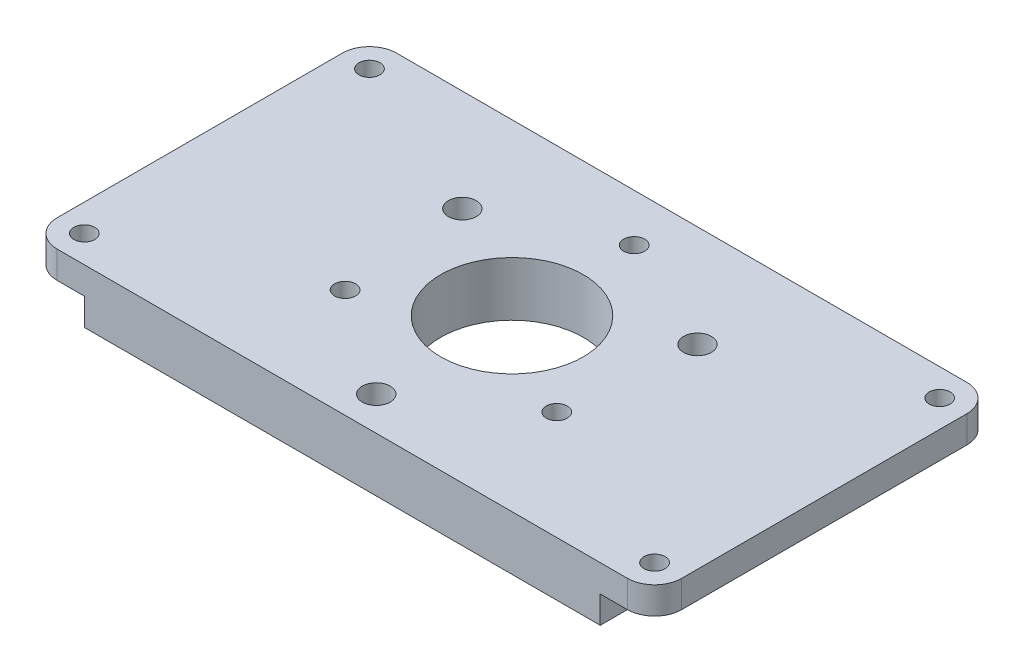
ISO-10303-21;
HEADER;
FILE_DESCRIPTION(('STEP AP214'),'2;1');
FILE_NAME('part.step','',(''),(''),'','','');
FILE_SCHEMA(('AUTOMOTIVE_DESIGN { 1 0 10303 214 1 1 1 1 }'));
ENDSEC;
DATA;
#1=APPLICATION_CONTEXT('core data for automotive mechanical design processes');
#2=APPLICATION_PROTOCOL_DEFINITION('international standard','automotive_design',2000,#1);
#3=PRODUCT_CONTEXT('',#1,'mechanical');
#4=PRODUCT('Part','Part','',(#3));
#5=PRODUCT_RELATED_PRODUCT_CATEGORY('part','',(#4));
#6=PRODUCT_DEFINITION_FORMATION('','',#4);
#7=PRODUCT_DEFINITION_CONTEXT('part definition',#1,'design');
#8=PRODUCT_DEFINITION('design','',#6,#7);
#9=PRODUCT_DEFINITION_SHAPE('','',#8);
#10=(LENGTH_UNIT() NAMED_UNIT(*) SI_UNIT(.MILLI.,.METRE.));
#11=(NAMED_UNIT(*) PLANE_ANGLE_UNIT() SI_UNIT($,.RADIAN.));
#12=(NAMED_UNIT(*) SI_UNIT($,.STERADIAN.) SOLID_ANGLE_UNIT());
#13=UNCERTAINTY_MEASURE_WITH_UNIT(LENGTH_MEASURE(1.E-05),#10,'distance_accuracy_value','');
#14=(GEOMETRIC_REPRESENTATION_CONTEXT(3) GLOBAL_UNCERTAINTY_ASSIGNED_CONTEXT((#13)) GLOBAL_UNIT_ASSIGNED_CONTEXT((#10,
#11,#12)) REPRESENTATION_CONTEXT('',''));
#15=CARTESIAN_POINT('',(0.,0.,0.));
#16=DIRECTION('',(0.,0.,1.));
#17=DIRECTION('',(1.,0.,0.));
#18=AXIS2_PLACEMENT_3D('',#15,#16,#17);
#19=CARTESIAN_POINT('',(0.,-4.,-18.));
#20=DIRECTION('',(0.,1.,0.));
#21=DIRECTION('',(0.,0.,1.));
#22=AXIS2_PLACEMENT_3D('',#19,#20,#21);
#23=CYLINDRICAL_SURFACE('',#22,1.55);
#24=CARTESIAN_POINT('',(0.,4.,-18.));
#25=DIRECTION('',(0.,1.,0.));
#26=DIRECTION('',(0.,0.,1.));
#27=AXIS2_PLACEMENT_3D('',#24,#25,#26);
#28=CIRCLE('',#27,1.55);
#29=CARTESIAN_POINT('',(0.,4.,-16.45));
#30=VERTEX_POINT('',#29);
#31=EDGE_CURVE('E331',#30,#30,#28,.T.);
#32=ORIENTED_EDGE('',*,*,#31,.T.);
#33=EDGE_LOOP('',(#32));
#34=FACE_BOUND('',#33,.T.);
#35=CARTESIAN_POINT('',(0.,1.,-18.));
#36=DIRECTION('',(0.,-1.,0.));
#37=DIRECTION('',(0.,0.,-1.));
#38=AXIS2_PLACEMENT_3D('',#35,#36,#37);
#39=CIRCLE('',#38,1.55);
#40=CARTESIAN_POINT('',(0.,1.,-19.55));
#41=VERTEX_POINT('',#40);
#42=EDGE_CURVE('E43',#41,#41,#39,.F.);
#43=ORIENTED_EDGE('',*,*,#42,.F.);
#44=EDGE_LOOP('',(#43));
#45=FACE_BOUND('',#44,.T.);
#46=ADVANCED_FACE('F39',(#34,#45),#23,.F.);
#47=CARTESIAN_POINT('',(15.5884572681211,-4.,8.99999999999927));
#48=DIRECTION('',(0.,1.,0.));
#49=DIRECTION('',(0.,0.,1.));
#50=AXIS2_PLACEMENT_3D('',#47,#48,#49);
#51=CYLINDRICAL_SURFACE('',#50,1.55);
#52=CARTESIAN_POINT('',(15.5884572681211,4.,8.99999999999927));
#53=DIRECTION('',(0.,1.,0.));
#54=DIRECTION('',(0.,0.,1.));
#55=AXIS2_PLACEMENT_3D('',#52,#53,#54);
#56=CIRCLE('',#55,1.55);
#57=CARTESIAN_POINT('',(15.5884572681211,4.,10.5499999999993));
#58=VERTEX_POINT('',#57);
#59=EDGE_CURVE('E328',#58,#58,#56,.T.);
#60=ORIENTED_EDGE('',*,*,#59,.T.);
#61=EDGE_LOOP('',(#60));
#62=FACE_BOUND('',#61,.T.);
#63=CARTESIAN_POINT('',(15.5884572681211,1.,8.99999999999927));
#64=DIRECTION('',(0.,-1.,0.));
#65=DIRECTION('',(0.,0.,-1.));
#66=AXIS2_PLACEMENT_3D('',#63,#64,#65);
#67=CIRCLE('',#66,1.55);
#68=CARTESIAN_POINT('',(15.5884572681211,1.,7.44999999999927));
#69=VERTEX_POINT('',#68);
#70=EDGE_CURVE('E218',#69,#69,#67,.F.);
#71=ORIENTED_EDGE('',*,*,#70,.F.);
#72=EDGE_LOOP('',(#71));
#73=FACE_BOUND('',#72,.T.);
#74=ADVANCED_FACE('F229',(#62,#73),#51,.F.);
#75=CARTESIAN_POINT('',(-15.5884572681186,-4.,9.00000000000072));
#76=DIRECTION('',(0.,1.,0.));
#77=DIRECTION('',(0.,0.,1.));
#78=AXIS2_PLACEMENT_3D('',#75,#76,#77);
#79=CYLINDRICAL_SURFACE('',#78,1.55);
#80=CARTESIAN_POINT('',(-15.5884572681186,4.,9.00000000000072));
#81=DIRECTION('',(0.,1.,0.));
#82=DIRECTION('',(0.,0.,1.));
#83=AXIS2_PLACEMENT_3D('',#80,#81,#82);
#84=CIRCLE('',#83,1.55);
#85=CARTESIAN_POINT('',(-15.5884572681186,4.,10.5500000000007));
#86=VERTEX_POINT('',#85);
#87=EDGE_CURVE('E325',#86,#86,#84,.T.);
#88=ORIENTED_EDGE('',*,*,#87,.T.);
#89=EDGE_LOOP('',(#88));
#90=FACE_BOUND('',#89,.T.);
#91=CARTESIAN_POINT('',(-15.5884572681186,1.,9.00000000000072));
#92=DIRECTION('',(0.,-1.,0.));
#93=DIRECTION('',(0.,0.,-1.));
#94=AXIS2_PLACEMENT_3D('',#91,#92,#93);
#95=CIRCLE('',#94,1.55);
#96=CARTESIAN_POINT('',(-15.5884572681186,1.,7.45000000000072));
#97=VERTEX_POINT('',#96);
#98=EDGE_CURVE('E216',#97,#97,#95,.F.);
#99=ORIENTED_EDGE('',*,*,#98,.F.);
#100=EDGE_LOOP('',(#99));
#101=FACE_BOUND('',#100,.T.);
#102=ADVANCED_FACE('F235',(#90,#101),#79,.F.);
#103=CARTESIAN_POINT('',(-46.,-4.,25.));
#104=DIRECTION('',(-1.,0.,0.));
#105=DIRECTION('',(0.,0.,1.));
#106=AXIS2_PLACEMENT_3D('',#103,#104,#105);
#107=PLANE('',#106);
#108=DIRECTION('',(0.,0.,1.));
#109=VECTOR('',#108,1.);
#110=CARTESIAN_POINT('',(-46.,0.,25.));
#111=LINE('',#110,#109);
#112=CARTESIAN_POINT('',(-46.,0.,-21.));
#113=VERTEX_POINT('',#112);
#114=CARTESIAN_POINT('',(-46.,0.,21.));
#115=VERTEX_POINT('',#114);
#116=EDGE_CURVE('E382',#113,#115,#111,.T.);
#117=ORIENTED_EDGE('',*,*,#116,.T.);
#118=DIRECTION('',(0.,1.,0.));
#119=VECTOR('',#118,1.);
#120=CARTESIAN_POINT('',(-46.,-4.,21.));
#121=LINE('',#120,#119);
#122=CARTESIAN_POINT('',(-46.,4.,21.));
#123=VERTEX_POINT('',#122);
#124=EDGE_CURVE('E159',#115,#123,#121,.T.);
#125=ORIENTED_EDGE('',*,*,#124,.T.);
#126=DIRECTION('',(0.,0.,1.));
#127=VECTOR('',#126,1.);
#128=CARTESIAN_POINT('',(-46.,4.,25.));
#129=LINE('',#128,#127);
#130=CARTESIAN_POINT('',(-46.,4.,-21.));
#131=VERTEX_POINT('',#130);
#132=EDGE_CURVE('E172',#131,#123,#129,.T.);
#133=ORIENTED_EDGE('',*,*,#132,.F.);
#134=DIRECTION('',(0.,1.,0.));
#135=VECTOR('',#134,1.);
#136=CARTESIAN_POINT('',(-46.,-4.,-21.));
#137=LINE('',#136,#135);
#138=EDGE_CURVE('E156',#131,#113,#137,.F.);
#139=ORIENTED_EDGE('',*,*,#138,.T.);
#140=EDGE_LOOP('',(#117,#125,#133,#139));
#141=FACE_BOUND('',#140,.T.);
#142=ADVANCED_FACE('F275',(#141),#107,.T.);
#143=CARTESIAN_POINT('',(-42.,-4.,21.));
#144=DIRECTION('',(0.,1.,0.));
#145=DIRECTION('',(0.,0.,1.));
#146=AXIS2_PLACEMENT_3D('',#143,#144,#145);
#147=CYLINDRICAL_SURFACE('',#146,1.55);
#148=CARTESIAN_POINT('',(-42.,4.,21.));
#149=DIRECTION('',(0.,1.,0.));
#150=DIRECTION('',(0.,0.,1.));
#151=AXIS2_PLACEMENT_3D('',#148,#149,#150);
#152=CIRCLE('',#151,1.55);
#153=CARTESIAN_POINT('',(-42.,4.,22.55));
#154=VERTEX_POINT('',#153);
#155=EDGE_CURVE('E169',#154,#154,#152,.T.);
#156=ORIENTED_EDGE('',*,*,#155,.T.);
#157=EDGE_LOOP('',(#156));
#158=FACE_BOUND('',#157,.T.);
#159=CARTESIAN_POINT('',(-42.,0.,21.));
#160=DIRECTION('',(0.,-1.,0.));
#161=DIRECTION('',(0.,0.,-1.));
#162=AXIS2_PLACEMENT_3D('',#159,#160,#161);
#163=CIRCLE('',#162,1.55);
#164=CARTESIAN_POINT('',(-42.,0.,19.45));
#165=VERTEX_POINT('',#164);
#166=EDGE_CURVE('E184',#165,#165,#163,.F.);
#167=ORIENTED_EDGE('',*,*,#166,.F.);
#168=EDGE_LOOP('',(#167));
#169=FACE_BOUND('',#168,.T.);
#170=ADVANCED_FACE('F245',(#158,#169),#147,.F.);
#171=CARTESIAN_POINT('',(-42.,-4.,-21.));
#172=DIRECTION('',(0.,1.,0.));
#173=DIRECTION('',(0.,0.,1.));
#174=AXIS2_PLACEMENT_3D('',#171,#172,#173);
#175=CYLINDRICAL_SURFACE('',#174,1.55);
#176=CARTESIAN_POINT('',(-42.,4.,-21.));
#177=DIRECTION('',(0.,1.,0.));
#178=DIRECTION('',(0.,0.,-1.));
#179=AXIS2_PLACEMENT_3D('',#176,#177,#178);
#180=CIRCLE('',#179,1.55);
#181=CARTESIAN_POINT('',(-42.,4.,-22.55));
#182=VERTEX_POINT('',#181);
#183=EDGE_CURVE('E333',#182,#182,#180,.T.);
#184=ORIENTED_EDGE('',*,*,#183,.T.);
#185=EDGE_LOOP('',(#184));
#186=FACE_BOUND('',#185,.T.);
#187=CARTESIAN_POINT('',(-42.,0.,-21.));
#188=DIRECTION('',(0.,-1.,0.));
#189=DIRECTION('',(0.,0.,-1.));
#190=AXIS2_PLACEMENT_3D('',#187,#188,#189);
#191=CIRCLE('',#190,1.55);
#192=CARTESIAN_POINT('',(-42.,0.,-22.55));
#193=VERTEX_POINT('',#192);
#194=EDGE_CURVE('E182',#193,#193,#191,.F.);
#195=ORIENTED_EDGE('',*,*,#194,.F.);
#196=EDGE_LOOP('',(#195));
#197=FACE_BOUND('',#196,.T.);
#198=ADVANCED_FACE('F241',(#186,#197),#175,.F.);
#199=CARTESIAN_POINT('',(46.,-4.,25.));
#200=DIRECTION('',(1.,0.,0.));
#201=DIRECTION('',(0.,0.,-1.));
#202=AXIS2_PLACEMENT_3D('',#199,#200,#201);
#203=PLANE('',#202);
#204=DIRECTION('',(0.,0.,-1.));
#205=VECTOR('',#204,1.);
#206=CARTESIAN_POINT('',(46.,4.,25.));
#207=LINE('',#206,#205);
#208=CARTESIAN_POINT('',(46.,4.,21.));
#209=VERTEX_POINT('',#208);
#210=CARTESIAN_POINT('',(46.,4.,-21.));
#211=VERTEX_POINT('',#210);
#212=EDGE_CURVE('E165',#209,#211,#207,.T.);
#213=ORIENTED_EDGE('',*,*,#212,.F.);
#214=DIRECTION('',(0.,1.,0.));
#215=VECTOR('',#214,1.);
#216=CARTESIAN_POINT('',(46.,-4.,21.));
#217=LINE('',#216,#215);
#218=CARTESIAN_POINT('',(46.,0.,21.));
#219=VERTEX_POINT('',#218);
#220=EDGE_CURVE('E62',#209,#219,#217,.F.);
#221=ORIENTED_EDGE('',*,*,#220,.T.);
#222=DIRECTION('',(0.,0.,-1.));
#223=VECTOR('',#222,1.);
#224=CARTESIAN_POINT('',(46.,0.,25.));
#225=LINE('',#224,#223);
#226=CARTESIAN_POINT('',(46.,0.,-21.));
#227=VERTEX_POINT('',#226);
#228=EDGE_CURVE('E315',#219,#227,#225,.T.);
#229=ORIENTED_EDGE('',*,*,#228,.T.);
#230=DIRECTION('',(0.,1.,0.));
#231=VECTOR('',#230,1.);
#232=CARTESIAN_POINT('',(46.,-4.,-21.));
#233=LINE('',#232,#231);
#234=EDGE_CURVE('E211',#227,#211,#233,.T.);
#235=ORIENTED_EDGE('',*,*,#234,.T.);
#236=EDGE_LOOP('',(#213,#221,#229,#235));
#237=FACE_BOUND('',#236,.T.);
#238=ADVANCED_FACE('F244',(#237),#203,.T.);
#239=CARTESIAN_POINT('',(42.,-4.,21.));
#240=DIRECTION('',(0.,1.,0.));
#241=DIRECTION('',(0.,0.,1.));
#242=AXIS2_PLACEMENT_3D('',#239,#240,#241);
#243=CYLINDRICAL_SURFACE('',#242,1.55);
#244=CARTESIAN_POINT('',(42.,4.,21.));
#245=DIRECTION('',(0.,1.,0.));
#246=DIRECTION('',(0.,0.,-1.));
#247=AXIS2_PLACEMENT_3D('',#244,#245,#246);
#248=CIRCLE('',#247,1.55);
#249=CARTESIAN_POINT('',(42.,4.,19.45));
#250=VERTEX_POINT('',#249);
#251=EDGE_CURVE('E349',#250,#250,#248,.T.);
#252=ORIENTED_EDGE('',*,*,#251,.T.);
#253=EDGE_LOOP('',(#252));
#254=FACE_BOUND('',#253,.T.);
#255=CARTESIAN_POINT('',(42.,0.,21.));
#256=DIRECTION('',(0.,-1.,0.));
#257=DIRECTION('',(0.,0.,-1.));
#258=AXIS2_PLACEMENT_3D('',#255,#256,#257);
#259=CIRCLE('',#258,1.55);
#260=CARTESIAN_POINT('',(42.,0.,19.45));
#261=VERTEX_POINT('',#260);
#262=EDGE_CURVE('E180',#261,#261,#259,.F.);
#263=ORIENTED_EDGE('',*,*,#262,.F.);
#264=EDGE_LOOP('',(#263));
#265=FACE_BOUND('',#264,.T.);
#266=ADVANCED_FACE('F250',(#254,#265),#243,.F.);
#267=CARTESIAN_POINT('',(42.,-4.,-21.));
#268=DIRECTION('',(0.,1.,0.));
#269=DIRECTION('',(0.,0.,1.));
#270=AXIS2_PLACEMENT_3D('',#267,#268,#269);
#271=CYLINDRICAL_SURFACE('',#270,1.55);
#272=CARTESIAN_POINT('',(42.,4.,-21.));
#273=DIRECTION('',(0.,1.,0.));
#274=DIRECTION('',(0.,0.,1.));
#275=AXIS2_PLACEMENT_3D('',#272,#273,#274);
#276=CIRCLE('',#275,1.55);
#277=CARTESIAN_POINT('',(42.,4.,-19.45));
#278=VERTEX_POINT('',#277);
#279=EDGE_CURVE('E336',#278,#278,#276,.T.);
#280=ORIENTED_EDGE('',*,*,#279,.T.);
#281=EDGE_LOOP('',(#280));
#282=FACE_BOUND('',#281,.T.);
#283=CARTESIAN_POINT('',(42.,0.,-21.));
#284=DIRECTION('',(0.,-1.,0.));
#285=DIRECTION('',(0.,0.,-1.));
#286=AXIS2_PLACEMENT_3D('',#283,#284,#285);
#287=CIRCLE('',#286,1.55);
#288=CARTESIAN_POINT('',(42.,0.,-22.55));
#289=VERTEX_POINT('',#288);
#290=EDGE_CURVE('E177',#289,#289,#287,.F.);
#291=ORIENTED_EDGE('',*,*,#290,.F.);
#292=EDGE_LOOP('',(#291));
#293=FACE_BOUND('',#292,.T.);
#294=ADVANCED_FACE('F247',(#282,#293),#271,.F.);
#295=CARTESIAN_POINT('',(-46.,-4.,25.));
#296=DIRECTION('',(0.,0.,1.));
#297=DIRECTION('',(1.,0.,0.));
#298=AXIS2_PLACEMENT_3D('',#295,#296,#297);
#299=PLANE('',#298);
#300=DIRECTION('',(1.,0.,0.));
#301=VECTOR('',#300,1.);
#302=CARTESIAN_POINT('',(-46.,4.,25.));
#303=LINE('',#302,#301);
#304=CARTESIAN_POINT('',(-42.,4.,25.));
#305=VERTEX_POINT('',#304);
#306=CARTESIAN_POINT('',(42.,4.,25.));
#307=VERTEX_POINT('',#306);
#308=EDGE_CURVE('E161',#305,#307,#303,.T.);
#309=ORIENTED_EDGE('',*,*,#308,.F.);
#310=DIRECTION('',(0.,1.,0.));
#311=VECTOR('',#310,1.);
#312=CARTESIAN_POINT('',(-42.,-4.,25.));
#313=LINE('',#312,#311);
#314=CARTESIAN_POINT('',(-42.,0.,25.));
#315=VERTEX_POINT('',#314);
#316=EDGE_CURVE('E200',#305,#315,#313,.F.);
#317=ORIENTED_EDGE('',*,*,#316,.T.);
#318=DIRECTION('',(1.,0.,0.));
#319=VECTOR('',#318,1.);
#320=CARTESIAN_POINT('',(-46.,0.,25.));
#321=LINE('',#320,#319);
#322=CARTESIAN_POINT('',(-38.,0.,25.));
#323=VERTEX_POINT('',#322);
#324=EDGE_CURVE('E148',#315,#323,#321,.T.);
#325=ORIENTED_EDGE('',*,*,#324,.T.);
#326=DIRECTION('',(0.,-1.,0.));
#327=VECTOR('',#326,1.);
#328=CARTESIAN_POINT('',(-38.,54.6359556046887,25.));
#329=LINE('',#328,#327);
#330=CARTESIAN_POINT('',(-38.,-4.,25.));
#331=VERTEX_POINT('',#330);
#332=EDGE_CURVE('E133',#323,#331,#329,.T.);
#333=ORIENTED_EDGE('',*,*,#332,.T.);
#334=DIRECTION('',(1.,0.,0.));
#335=VECTOR('',#334,1.);
#336=CARTESIAN_POINT('',(-46.,-4.,25.));
#337=LINE('',#336,#335);
#338=CARTESIAN_POINT('',(38.,-4.,25.));
#339=VERTEX_POINT('',#338);
#340=EDGE_CURVE('E145',#331,#339,#337,.T.);
#341=ORIENTED_EDGE('',*,*,#340,.T.);
#342=DIRECTION('',(0.,-1.,0.));
#343=VECTOR('',#342,1.);
#344=CARTESIAN_POINT('',(38.,54.6359556046887,25.));
#345=LINE('',#344,#343);
#346=CARTESIAN_POINT('',(38.,0.,25.));
#347=VERTEX_POINT('',#346);
#348=EDGE_CURVE('E316',#347,#339,#345,.T.);
#349=ORIENTED_EDGE('',*,*,#348,.F.);
#350=DIRECTION('',(1.,0.,0.));
#351=VECTOR('',#350,1.);
#352=CARTESIAN_POINT('',(46.,0.,25.));
#353=LINE('',#352,#351);
#354=CARTESIAN_POINT('',(42.,0.,25.));
#355=VERTEX_POINT('',#354);
#356=EDGE_CURVE('E181',#347,#355,#353,.T.);
#357=ORIENTED_EDGE('',*,*,#356,.T.);
#358=DIRECTION('',(0.,1.,0.));
#359=VECTOR('',#358,1.);
#360=CARTESIAN_POINT('',(42.,-4.,25.));
#361=LINE('',#360,#359);
#362=EDGE_CURVE('E197',#355,#307,#361,.T.);
#363=ORIENTED_EDGE('',*,*,#362,.T.);
#364=EDGE_LOOP('',(#309,#317,#325,#333,#341,#349,#357,#363));
#365=FACE_BOUND('',#364,.T.);
#366=ADVANCED_FACE('F143',(#365),#299,.T.);
#367=CARTESIAN_POINT('',(-46.,-4.,-25.));
#368=DIRECTION('',(0.,0.,-1.));
#369=DIRECTION('',(-1.,0.,0.));
#370=AXIS2_PLACEMENT_3D('',#367,#368,#369);
#371=PLANE('',#370);
#372=DIRECTION('',(-1.,0.,0.));
#373=VECTOR('',#372,1.);
#374=CARTESIAN_POINT('',(-46.,0.,-25.));
#375=LINE('',#374,#373);
#376=CARTESIAN_POINT('',(-38.,0.,-25.));
#377=VERTEX_POINT('',#376);
#378=CARTESIAN_POINT('',(-42.,0.,-25.));
#379=VERTEX_POINT('',#378);
#380=EDGE_CURVE('E185',#377,#379,#375,.T.);
#381=ORIENTED_EDGE('',*,*,#380,.T.);
#382=DIRECTION('',(0.,1.,0.));
#383=VECTOR('',#382,1.);
#384=CARTESIAN_POINT('',(-42.,-4.,-25.));
#385=LINE('',#384,#383);
#386=CARTESIAN_POINT('',(-42.,4.,-25.));
#387=VERTEX_POINT('',#386);
#388=EDGE_CURVE('E208',#379,#387,#385,.T.);
#389=ORIENTED_EDGE('',*,*,#388,.T.);
#390=DIRECTION('',(-1.,0.,0.));
#391=VECTOR('',#390,1.);
#392=CARTESIAN_POINT('',(-46.,4.,-25.));
#393=LINE('',#392,#391);
#394=CARTESIAN_POINT('',(42.,4.,-25.));
#395=VERTEX_POINT('',#394);
#396=EDGE_CURVE('E168',#395,#387,#393,.T.);
#397=ORIENTED_EDGE('',*,*,#396,.F.);
#398=DIRECTION('',(0.,1.,0.));
#399=VECTOR('',#398,1.);
#400=CARTESIAN_POINT('',(42.,-4.,-25.));
#401=LINE('',#400,#399);
#402=CARTESIAN_POINT('',(42.,0.,-25.));
#403=VERTEX_POINT('',#402);
#404=EDGE_CURVE('E206',#395,#403,#401,.F.);
#405=ORIENTED_EDGE('',*,*,#404,.T.);
#406=DIRECTION('',(-1.,0.,0.));
#407=VECTOR('',#406,1.);
#408=CARTESIAN_POINT('',(46.,0.,-25.));
#409=LINE('',#408,#407);
#410=CARTESIAN_POINT('',(38.,0.,-25.));
#411=VERTEX_POINT('',#410);
#412=EDGE_CURVE('E318',#403,#411,#409,.T.);
#413=ORIENTED_EDGE('',*,*,#412,.T.);
#414=DIRECTION('',(0.,-1.,0.));
#415=VECTOR('',#414,1.);
#416=CARTESIAN_POINT('',(38.,54.6359556046887,-25.));
#417=LINE('',#416,#415);
#418=CARTESIAN_POINT('',(38.,-4.,-25.));
#419=VERTEX_POINT('',#418);
#420=EDGE_CURVE('E392',#411,#419,#417,.T.);
#421=ORIENTED_EDGE('',*,*,#420,.T.);
#422=DIRECTION('',(-1.,0.,0.));
#423=VECTOR('',#422,1.);
#424=CARTESIAN_POINT('',(-46.,-4.,-25.));
#425=LINE('',#424,#423);
#426=CARTESIAN_POINT('',(-38.,-4.,-25.));
#427=VERTEX_POINT('',#426);
#428=EDGE_CURVE('E157',#419,#427,#425,.T.);
#429=ORIENTED_EDGE('',*,*,#428,.T.);
#430=DIRECTION('',(0.,-1.,0.));
#431=VECTOR('',#430,1.);
#432=CARTESIAN_POINT('',(-38.,54.6359556046887,-25.));
#433=LINE('',#432,#431);
#434=EDGE_CURVE('E135',#377,#427,#433,.T.);
#435=ORIENTED_EDGE('',*,*,#434,.F.);
#436=EDGE_LOOP('',(#381,#389,#397,#405,#413,#421,#429,#435));
#437=FACE_BOUND('',#436,.T.);
#438=ADVANCED_FACE('F279',(#437),#371,.T.);
#439=CARTESIAN_POINT('',(0.,-4.,0.));
#440=DIRECTION('',(0.,-1.,0.));
#441=DIRECTION('',(0.,0.,-1.));
#442=AXIS2_PLACEMENT_3D('',#439,#440,#441);
#443=PLANE('',#442);
#444=CARTESIAN_POINT('',(0.,-4.,-18.));
#445=DIRECTION('',(0.,-1.,0.));
#446=DIRECTION('',(0.,0.,-1.));
#447=AXIS2_PLACEMENT_3D('',#444,#445,#446);
#448=CIRCLE('',#447,6.);
#449=CARTESIAN_POINT('',(0.,-4.,-24.));
#450=VERTEX_POINT('',#449);
#451=EDGE_CURVE('E417',#450,#450,#448,.T.);
#452=ORIENTED_EDGE('',*,*,#451,.F.);
#453=EDGE_LOOP('',(#452));
#454=FACE_BOUND('',#453,.T.);
#455=CARTESIAN_POINT('',(-15.5884572681207,-4.,8.99999999999956));
#456=DIRECTION('',(0.,-1.,0.));
#457=DIRECTION('',(0.,0.,-1.));
#458=AXIS2_PLACEMENT_3D('',#455,#456,#457);
#459=CIRCLE('',#458,6.00000000000069);
#460=CARTESIAN_POINT('',(-15.5884572681207,-4.,2.99999999999887));
#461=VERTEX_POINT('',#460);
#462=EDGE_CURVE('E411',#461,#461,#459,.T.);
#463=ORIENTED_EDGE('',*,*,#462,.F.);
#464=EDGE_LOOP('',(#463));
#465=FACE_BOUND('',#464,.T.);
#466=CARTESIAN_POINT('',(15.5884572681191,-4.,9.00000000000045));
#467=DIRECTION('',(0.,-1.,0.));
#468=DIRECTION('',(0.,0.,-1.));
#469=AXIS2_PLACEMENT_3D('',#466,#467,#468);
#470=CIRCLE('',#469,6.00000000000103);
#471=CARTESIAN_POINT('',(15.5884572681191,-4.,2.99999999999942));
#472=VERTEX_POINT('',#471);
#473=EDGE_CURVE('E405',#472,#472,#470,.T.);
#474=ORIENTED_EDGE('',*,*,#473,.F.);
#475=EDGE_LOOP('',(#474));
#476=FACE_BOUND('',#475,.T.);
#477=DIRECTION('',(0.,0.,1.));
#478=VECTOR('',#477,1.);
#479=CARTESIAN_POINT('',(-38.,-4.,25.));
#480=LINE('',#479,#478);
#481=EDGE_CURVE('E130',#427,#331,#480,.T.);
#482=ORIENTED_EDGE('',*,*,#481,.F.);
#483=ORIENTED_EDGE('',*,*,#428,.F.);
#484=DIRECTION('',(0.,0.,-1.));
#485=VECTOR('',#484,1.);
#486=CARTESIAN_POINT('',(38.,-4.,25.));
#487=LINE('',#486,#485);
#488=EDGE_CURVE('E155',#339,#419,#487,.T.);
#489=ORIENTED_EDGE('',*,*,#488,.F.);
#490=ORIENTED_EDGE('',*,*,#340,.F.);
#491=EDGE_LOOP('',(#482,#483,#489,#490));
#492=FACE_BOUND('',#491,.T.);
#493=CARTESIAN_POINT('',(17.3205080756889,-4.,-9.99999999999984));
#494=DIRECTION('',(0.,1.,0.));
#495=DIRECTION('',(0.,0.,1.));
#496=AXIS2_PLACEMENT_3D('',#493,#494,#495);
#497=CIRCLE('',#496,2.05);
#498=CARTESIAN_POINT('',(17.3205080756889,-4.,-7.94999999999984));
#499=VERTEX_POINT('',#498);
#500=EDGE_CURVE('E340',#499,#499,#497,.T.);
#501=ORIENTED_EDGE('',*,*,#500,.T.);
#502=EDGE_LOOP('',(#501));
#503=FACE_BOUND('',#502,.T.);
#504=CARTESIAN_POINT('',(-17.3205080756887,-4.,-10.0000000000001));
#505=DIRECTION('',(0.,1.,0.));
#506=DIRECTION('',(0.,0.,1.));
#507=AXIS2_PLACEMENT_3D('',#504,#505,#506);
#508=CIRCLE('',#507,2.05);
#509=CARTESIAN_POINT('',(-17.3205080756887,-4.,-7.95000000000009));
#510=VERTEX_POINT('',#509);
#511=EDGE_CURVE('E346',#510,#510,#508,.T.);
#512=ORIENTED_EDGE('',*,*,#511,.T.);
#513=EDGE_LOOP('',(#512));
#514=FACE_BOUND('',#513,.T.);
#515=CARTESIAN_POINT('',(0.,-4.,20.));
#516=DIRECTION('',(0.,1.,0.));
#517=DIRECTION('',(0.,0.,1.));
#518=AXIS2_PLACEMENT_3D('',#515,#516,#517);
#519=CIRCLE('',#518,2.05);
#520=CARTESIAN_POINT('',(0.,-4.,22.05));
#521=VERTEX_POINT('',#520);
#522=EDGE_CURVE('E355',#521,#521,#519,.T.);
#523=ORIENTED_EDGE('',*,*,#522,.T.);
#524=EDGE_LOOP('',(#523));
#525=FACE_BOUND('',#524,.T.);
#526=CARTESIAN_POINT('',(0.,-4.,0.));
#527=DIRECTION('',(0.,1.,0.));
#528=DIRECTION('',(0.,0.,1.));
#529=AXIS2_PLACEMENT_3D('',#526,#527,#528);
#530=CIRCLE('',#529,10.5);
#531=CARTESIAN_POINT('',(0.,-4.,10.5));
#532=VERTEX_POINT('',#531);
#533=EDGE_CURVE('E361',#532,#532,#530,.T.);
#534=ORIENTED_EDGE('',*,*,#533,.T.);
#535=EDGE_LOOP('',(#534));
#536=FACE_BOUND('',#535,.T.);
#537=ADVANCED_FACE('F153',(#454,#465,#476,#492,#503,#514,#525,#536),#443,.T.);
#538=CARTESIAN_POINT('',(0.,4.,0.));
#539=DIRECTION('',(0.,-1.,0.));
#540=DIRECTION('',(0.,0.,-1.));
#541=AXIS2_PLACEMENT_3D('',#538,#539,#540);
#542=PLANE('',#541);
#543=ORIENTED_EDGE('',*,*,#87,.F.);
#544=EDGE_LOOP('',(#543));
#545=FACE_BOUND('',#544,.T.);
#546=ORIENTED_EDGE('',*,*,#59,.F.);
#547=EDGE_LOOP('',(#546));
#548=FACE_BOUND('',#547,.T.);
#549=ORIENTED_EDGE('',*,*,#31,.F.);
#550=EDGE_LOOP('',(#549));
#551=FACE_BOUND('',#550,.T.);
#552=ORIENTED_EDGE('',*,*,#183,.F.);
#553=EDGE_LOOP('',(#552));
#554=FACE_BOUND('',#553,.T.);
#555=ORIENTED_EDGE('',*,*,#279,.F.);
#556=EDGE_LOOP('',(#555));
#557=FACE_BOUND('',#556,.T.);
#558=CARTESIAN_POINT('',(17.3205080756889,4.,-9.99999999999984));
#559=DIRECTION('',(0.,1.,0.));
#560=DIRECTION('',(0.,0.,1.));
#561=AXIS2_PLACEMENT_3D('',#558,#559,#560);
#562=CIRCLE('',#561,2.05);
#563=CARTESIAN_POINT('',(17.3205080756889,4.,-7.94999999999984));
#564=VERTEX_POINT('',#563);
#565=EDGE_CURVE('E339',#564,#564,#562,.T.);
#566=ORIENTED_EDGE('',*,*,#565,.F.);
#567=EDGE_LOOP('',(#566));
#568=FACE_BOUND('',#567,.T.);
#569=CARTESIAN_POINT('',(-17.3205080756887,4.,-10.0000000000001));
#570=DIRECTION('',(0.,1.,0.));
#571=DIRECTION('',(0.,0.,1.));
#572=AXIS2_PLACEMENT_3D('',#569,#570,#571);
#573=CIRCLE('',#572,2.05);
#574=CARTESIAN_POINT('',(-17.3205080756887,4.,-7.95000000000009));
#575=VERTEX_POINT('',#574);
#576=EDGE_CURVE('E343',#575,#575,#573,.T.);
#577=ORIENTED_EDGE('',*,*,#576,.F.);
#578=EDGE_LOOP('',(#577));
#579=FACE_BOUND('',#578,.T.);
#580=ORIENTED_EDGE('',*,*,#251,.F.);
#581=EDGE_LOOP('',(#580));
#582=FACE_BOUND('',#581,.T.);
#583=CARTESIAN_POINT('',(0.,4.,20.));
#584=DIRECTION('',(0.,1.,0.));
#585=DIRECTION('',(0.,0.,1.));
#586=AXIS2_PLACEMENT_3D('',#583,#584,#585);
#587=CIRCLE('',#586,2.05);
#588=CARTESIAN_POINT('',(0.,4.,22.05));
#589=VERTEX_POINT('',#588);
#590=EDGE_CURVE('E354',#589,#589,#587,.T.);
#591=ORIENTED_EDGE('',*,*,#590,.F.);
#592=EDGE_LOOP('',(#591));
#593=FACE_BOUND('',#592,.T.);
#594=CARTESIAN_POINT('',(0.,4.,0.));
#595=DIRECTION('',(0.,1.,0.));
#596=DIRECTION('',(0.,0.,1.));
#597=AXIS2_PLACEMENT_3D('',#594,#595,#596);
#598=CIRCLE('',#597,10.5);
#599=CARTESIAN_POINT('',(0.,4.,10.5));
#600=VERTEX_POINT('',#599);
#601=EDGE_CURVE('E358',#600,#600,#598,.T.);
#602=ORIENTED_EDGE('',*,*,#601,.F.);
#603=EDGE_LOOP('',(#602));
#604=FACE_BOUND('',#603,.T.);
#605=ORIENTED_EDGE('',*,*,#155,.F.);
#606=EDGE_LOOP('',(#605));
#607=FACE_BOUND('',#606,.T.);
#608=ORIENTED_EDGE('',*,*,#132,.T.);
#609=CARTESIAN_POINT('',(-42.,4.,21.));
#610=DIRECTION('',(0.,-1.,0.));
#611=DIRECTION('',(0.,0.,-1.));
#612=AXIS2_PLACEMENT_3D('',#609,#610,#611);
#613=CIRCLE('',#612,4.);
#614=EDGE_CURVE('E195',#123,#305,#613,.F.);
#615=ORIENTED_EDGE('',*,*,#614,.T.);
#616=ORIENTED_EDGE('',*,*,#308,.T.);
#617=CARTESIAN_POINT('',(42.,4.,21.));
#618=DIRECTION('',(0.,-1.,0.));
#619=DIRECTION('',(0.,0.,-1.));
#620=AXIS2_PLACEMENT_3D('',#617,#618,#619);
#621=CIRCLE('',#620,4.);
#622=EDGE_CURVE('E191',#307,#209,#621,.F.);
#623=ORIENTED_EDGE('',*,*,#622,.T.);
#624=ORIENTED_EDGE('',*,*,#212,.T.);
#625=CARTESIAN_POINT('',(42.,4.,-21.));
#626=DIRECTION('',(0.,-1.,0.));
#627=DIRECTION('',(0.,0.,-1.));
#628=AXIS2_PLACEMENT_3D('',#625,#626,#627);
#629=CIRCLE('',#628,4.);
#630=EDGE_CURVE('E189',#211,#395,#629,.F.);
#631=ORIENTED_EDGE('',*,*,#630,.T.);
#632=ORIENTED_EDGE('',*,*,#396,.T.);
#633=CARTESIAN_POINT('',(-42.,4.,-21.));
#634=DIRECTION('',(0.,-1.,0.));
#635=DIRECTION('',(0.,0.,-1.));
#636=AXIS2_PLACEMENT_3D('',#633,#634,#635);
#637=CIRCLE('',#636,4.);
#638=EDGE_CURVE('E193',#387,#131,#637,.F.);
#639=ORIENTED_EDGE('',*,*,#638,.T.);
#640=EDGE_LOOP('',(#608,#615,#616,#623,#624,#631,#632,#639));
#641=FACE_BOUND('',#640,.T.);
#642=ADVANCED_FACE('F271',(#545,#548,#551,#554,#557,#568,#579,#582,#593,#604,#607,#641),#542,.F.);
#643=CARTESIAN_POINT('',(0.,-4.,0.));
#644=DIRECTION('',(0.,1.,0.));
#645=DIRECTION('',(0.,0.,1.));
#646=AXIS2_PLACEMENT_3D('',#643,#644,#645);
#647=CYLINDRICAL_SURFACE('',#646,10.5);
#648=ORIENTED_EDGE('',*,*,#533,.F.);
#649=EDGE_LOOP('',(#648));
#650=FACE_BOUND('',#649,.T.);
#651=ORIENTED_EDGE('',*,*,#601,.T.);
#652=EDGE_LOOP('',(#651));
#653=FACE_BOUND('',#652,.T.);
#654=ADVANCED_FACE('F267',(#650,#653),#647,.F.);
#655=CARTESIAN_POINT('',(0.,-4.,20.));
#656=DIRECTION('',(0.,1.,0.));
#657=DIRECTION('',(0.,0.,1.));
#658=AXIS2_PLACEMENT_3D('',#655,#656,#657);
#659=CYLINDRICAL_SURFACE('',#658,2.05);
#660=ORIENTED_EDGE('',*,*,#522,.F.);
#661=EDGE_LOOP('',(#660));
#662=FACE_BOUND('',#661,.T.);
#663=ORIENTED_EDGE('',*,*,#590,.T.);
#664=EDGE_LOOP('',(#663));
#665=FACE_BOUND('',#664,.T.);
#666=ADVANCED_FACE('F260',(#662,#665),#659,.F.);
#667=CARTESIAN_POINT('',(-17.3205080756887,-4.,-10.0000000000001));
#668=DIRECTION('',(0.,1.,0.));
#669=DIRECTION('',(0.,0.,1.));
#670=AXIS2_PLACEMENT_3D('',#667,#668,#669);
#671=CYLINDRICAL_SURFACE('',#670,2.05);
#672=ORIENTED_EDGE('',*,*,#511,.F.);
#673=EDGE_LOOP('',(#672));
#674=FACE_BOUND('',#673,.T.);
#675=ORIENTED_EDGE('',*,*,#576,.T.);
#676=EDGE_LOOP('',(#675));
#677=FACE_BOUND('',#676,.T.);
#678=ADVANCED_FACE('F256',(#674,#677),#671,.F.);
#679=CARTESIAN_POINT('',(17.3205080756889,-4.,-9.99999999999984));
#680=DIRECTION('',(0.,1.,0.));
#681=DIRECTION('',(0.,0.,1.));
#682=AXIS2_PLACEMENT_3D('',#679,#680,#681);
#683=CYLINDRICAL_SURFACE('',#682,2.05);
#684=ORIENTED_EDGE('',*,*,#500,.F.);
#685=EDGE_LOOP('',(#684));
#686=FACE_BOUND('',#685,.T.);
#687=ORIENTED_EDGE('',*,*,#565,.T.);
#688=EDGE_LOOP('',(#687));
#689=FACE_BOUND('',#688,.T.);
#690=ADVANCED_FACE('F252',(#686,#689),#683,.F.);
#691=CARTESIAN_POINT('',(0.,0.,0.));
#692=DIRECTION('',(0.,-1.,0.));
#693=DIRECTION('',(0.,0.,-1.));
#694=AXIS2_PLACEMENT_3D('',#691,#692,#693);
#695=PLANE('',#694);
#696=ORIENTED_EDGE('',*,*,#228,.F.);
#697=CARTESIAN_POINT('',(42.,0.,21.));
#698=DIRECTION('',(0.,-1.,0.));
#699=DIRECTION('',(0.,0.,-1.));
#700=AXIS2_PLACEMENT_3D('',#697,#698,#699);
#701=CIRCLE('',#700,4.);
#702=EDGE_CURVE('E12',#219,#355,#701,.T.);
#703=ORIENTED_EDGE('',*,*,#702,.T.);
#704=ORIENTED_EDGE('',*,*,#356,.F.);
#705=DIRECTION('',(0.,0.,1.));
#706=VECTOR('',#705,1.);
#707=CARTESIAN_POINT('',(38.,0.,25.));
#708=LINE('',#707,#706);
#709=EDGE_CURVE('E390',#411,#347,#708,.T.);
#710=ORIENTED_EDGE('',*,*,#709,.F.);
#711=ORIENTED_EDGE('',*,*,#412,.F.);
#712=CARTESIAN_POINT('',(42.,0.,-21.));
#713=DIRECTION('',(0.,-1.,0.));
#714=DIRECTION('',(0.,0.,-1.));
#715=AXIS2_PLACEMENT_3D('',#712,#713,#714);
#716=CIRCLE('',#715,4.);
#717=EDGE_CURVE('E48',#403,#227,#716,.T.);
#718=ORIENTED_EDGE('',*,*,#717,.T.);
#719=EDGE_LOOP('',(#696,#703,#704,#710,#711,#718));
#720=FACE_BOUND('',#719,.T.);
#721=ORIENTED_EDGE('',*,*,#290,.T.);
#722=EDGE_LOOP('',(#721));
#723=FACE_BOUND('',#722,.T.);
#724=ORIENTED_EDGE('',*,*,#262,.T.);
#725=EDGE_LOOP('',(#724));
#726=FACE_BOUND('',#725,.T.);
#727=ADVANCED_FACE('F255',(#720,#723,#726),#695,.T.);
#728=CARTESIAN_POINT('',(38.,54.6359556046887,25.));
#729=DIRECTION('',(-1.,0.,0.));
#730=DIRECTION('',(0.,0.,1.));
#731=AXIS2_PLACEMENT_3D('',#728,#729,#730);
#732=PLANE('',#731);
#733=ORIENTED_EDGE('',*,*,#709,.T.);
#734=ORIENTED_EDGE('',*,*,#348,.T.);
#735=ORIENTED_EDGE('',*,*,#488,.T.);
#736=ORIENTED_EDGE('',*,*,#420,.F.);
#737=EDGE_LOOP('',(#733,#734,#735,#736));
#738=FACE_BOUND('',#737,.T.);
#739=ADVANCED_FACE('F397',(#738),#732,.F.);
#740=CARTESIAN_POINT('',(0.,0.,0.));
#741=DIRECTION('',(0.,-1.,0.));
#742=DIRECTION('',(0.,0.,-1.));
#743=AXIS2_PLACEMENT_3D('',#740,#741,#742);
#744=PLANE('',#743);
#745=ORIENTED_EDGE('',*,*,#324,.F.);
#746=CARTESIAN_POINT('',(-42.,0.,21.));
#747=DIRECTION('',(0.,-1.,0.));
#748=DIRECTION('',(0.,0.,-1.));
#749=AXIS2_PLACEMENT_3D('',#746,#747,#748);
#750=CIRCLE('',#749,4.);
#751=EDGE_CURVE('E204',#315,#115,#750,.T.);
#752=ORIENTED_EDGE('',*,*,#751,.T.);
#753=ORIENTED_EDGE('',*,*,#116,.F.);
#754=CARTESIAN_POINT('',(-42.,0.,-21.));
#755=DIRECTION('',(0.,-1.,0.));
#756=DIRECTION('',(0.,0.,-1.));
#757=AXIS2_PLACEMENT_3D('',#754,#755,#756);
#758=CIRCLE('',#757,4.);
#759=EDGE_CURVE('E202',#113,#379,#758,.T.);
#760=ORIENTED_EDGE('',*,*,#759,.T.);
#761=ORIENTED_EDGE('',*,*,#380,.F.);
#762=DIRECTION('',(0.,0.,-1.));
#763=VECTOR('',#762,1.);
#764=CARTESIAN_POINT('',(-38.,0.,25.));
#765=LINE('',#764,#763);
#766=EDGE_CURVE('E150',#323,#377,#765,.T.);
#767=ORIENTED_EDGE('',*,*,#766,.F.);
#768=EDGE_LOOP('',(#745,#752,#753,#760,#761,#767));
#769=FACE_BOUND('',#768,.T.);
#770=ORIENTED_EDGE('',*,*,#194,.T.);
#771=EDGE_LOOP('',(#770));
#772=FACE_BOUND('',#771,.T.);
#773=ORIENTED_EDGE('',*,*,#166,.T.);
#774=EDGE_LOOP('',(#773));
#775=FACE_BOUND('',#774,.T.);
#776=ADVANCED_FACE('F380',(#769,#772,#775),#744,.T.);
#777=CARTESIAN_POINT('',(-38.,54.6359556046887,25.));
#778=DIRECTION('',(1.,0.,0.));
#779=DIRECTION('',(0.,0.,-1.));
#780=AXIS2_PLACEMENT_3D('',#777,#778,#779);
#781=PLANE('',#780);
#782=ORIENTED_EDGE('',*,*,#766,.T.);
#783=ORIENTED_EDGE('',*,*,#434,.T.);
#784=ORIENTED_EDGE('',*,*,#481,.T.);
#785=ORIENTED_EDGE('',*,*,#332,.F.);
#786=EDGE_LOOP('',(#782,#783,#784,#785));
#787=FACE_BOUND('',#786,.T.);
#788=ADVANCED_FACE('F132',(#787),#781,.F.);
#789=CARTESIAN_POINT('',(-42.,-4.,21.));
#790=DIRECTION('',(0.,1.,0.));
#791=DIRECTION('',(0.,0.,1.));
#792=AXIS2_PLACEMENT_3D('',#789,#790,#791);
#793=CYLINDRICAL_SURFACE('',#792,4.);
#794=ORIENTED_EDGE('',*,*,#751,.F.);
#795=ORIENTED_EDGE('',*,*,#316,.F.);
#796=ORIENTED_EDGE('',*,*,#614,.F.);
#797=ORIENTED_EDGE('',*,*,#124,.F.);
#798=EDGE_LOOP('',(#794,#795,#796,#797));
#799=FACE_BOUND('',#798,.T.);
#800=ADVANCED_FACE('F294',(#799),#793,.T.);
#801=CARTESIAN_POINT('',(-42.,-4.,-21.));
#802=DIRECTION('',(0.,1.,0.));
#803=DIRECTION('',(0.,0.,1.));
#804=AXIS2_PLACEMENT_3D('',#801,#802,#803);
#805=CYLINDRICAL_SURFACE('',#804,4.);
#806=ORIENTED_EDGE('',*,*,#759,.F.);
#807=ORIENTED_EDGE('',*,*,#138,.F.);
#808=ORIENTED_EDGE('',*,*,#638,.F.);
#809=ORIENTED_EDGE('',*,*,#388,.F.);
#810=EDGE_LOOP('',(#806,#807,#808,#809));
#811=FACE_BOUND('',#810,.T.);
#812=ADVANCED_FACE('F297',(#811),#805,.T.);
#813=CARTESIAN_POINT('',(42.,-4.,21.));
#814=DIRECTION('',(0.,1.,0.));
#815=DIRECTION('',(0.,0.,1.));
#816=AXIS2_PLACEMENT_3D('',#813,#814,#815);
#817=CYLINDRICAL_SURFACE('',#816,4.);
#818=ORIENTED_EDGE('',*,*,#702,.F.);
#819=ORIENTED_EDGE('',*,*,#220,.F.);
#820=ORIENTED_EDGE('',*,*,#622,.F.);
#821=ORIENTED_EDGE('',*,*,#362,.F.);
#822=EDGE_LOOP('',(#818,#819,#820,#821));
#823=FACE_BOUND('',#822,.T.);
#824=ADVANCED_FACE('F300',(#823),#817,.T.);
#825=CARTESIAN_POINT('',(42.,-4.,-21.));
#826=DIRECTION('',(0.,1.,0.));
#827=DIRECTION('',(0.,0.,1.));
#828=AXIS2_PLACEMENT_3D('',#825,#826,#827);
#829=CYLINDRICAL_SURFACE('',#828,4.);
#830=ORIENTED_EDGE('',*,*,#717,.F.);
#831=ORIENTED_EDGE('',*,*,#404,.F.);
#832=ORIENTED_EDGE('',*,*,#630,.F.);
#833=ORIENTED_EDGE('',*,*,#234,.F.);
#834=EDGE_LOOP('',(#830,#831,#832,#833));
#835=FACE_BOUND('',#834,.T.);
#836=ADVANCED_FACE('F41',(#835),#829,.T.);
#837=CARTESIAN_POINT('',(-15.5884572681207,1.,8.99999999999956));
#838=DIRECTION('',(0.,-1.,0.));
#839=DIRECTION('',(0.,0.,-1.));
#840=AXIS2_PLACEMENT_3D('',#837,#838,#839);
#841=PLANE('',#840);
#842=CARTESIAN_POINT('',(-15.5884572681207,1.,8.99999999999956));
#843=DIRECTION('',(0.,-1.,0.));
#844=DIRECTION('',(0.,0.,-1.));
#845=AXIS2_PLACEMENT_3D('',#842,#843,#844);
#846=CIRCLE('',#845,6.00000000000069);
#847=CARTESIAN_POINT('',(-15.5884572681207,1.,2.99999999999887));
#848=VERTEX_POINT('',#847);
#849=EDGE_CURVE('E414',#848,#848,#846,.T.);
#850=ORIENTED_EDGE('',*,*,#849,.T.);
#851=EDGE_LOOP('',(#850));
#852=FACE_BOUND('',#851,.T.);
#853=ORIENTED_EDGE('',*,*,#98,.T.);
#854=EDGE_LOOP('',(#853));
#855=FACE_BOUND('',#854,.T.);
#856=ADVANCED_FACE('F307',(#852,#855),#841,.T.);
#857=CARTESIAN_POINT('',(-15.5884572681207,1.,8.99999999999956));
#858=DIRECTION('',(0.,-1.,0.));
#859=DIRECTION('',(0.,0.,-1.));
#860=AXIS2_PLACEMENT_3D('',#857,#858,#859);
#861=CYLINDRICAL_SURFACE('',#860,6.00000000000069);
#862=ORIENTED_EDGE('',*,*,#849,.F.);
#863=EDGE_LOOP('',(#862));
#864=FACE_BOUND('',#863,.T.);
#865=ORIENTED_EDGE('',*,*,#462,.T.);
#866=EDGE_LOOP('',(#865));
#867=FACE_BOUND('',#866,.T.);
#868=ADVANCED_FACE('F444',(#864,#867),#861,.F.);
#869=CARTESIAN_POINT('',(15.5884572681191,1.,9.00000000000045));
#870=DIRECTION('',(0.,-1.,0.));
#871=DIRECTION('',(0.,0.,-1.));
#872=AXIS2_PLACEMENT_3D('',#869,#870,#871);
#873=PLANE('',#872);
#874=CARTESIAN_POINT('',(15.5884572681191,1.,9.00000000000045));
#875=DIRECTION('',(0.,-1.,0.));
#876=DIRECTION('',(0.,0.,-1.));
#877=AXIS2_PLACEMENT_3D('',#874,#875,#876);
#878=CIRCLE('',#877,6.00000000000103);
#879=CARTESIAN_POINT('',(15.5884572681191,1.,2.99999999999942));
#880=VERTEX_POINT('',#879);
#881=EDGE_CURVE('E408',#880,#880,#878,.T.);
#882=ORIENTED_EDGE('',*,*,#881,.T.);
#883=EDGE_LOOP('',(#882));
#884=FACE_BOUND('',#883,.T.);
#885=ORIENTED_EDGE('',*,*,#70,.T.);
#886=EDGE_LOOP('',(#885));
#887=FACE_BOUND('',#886,.T.);
#888=ADVANCED_FACE('F436',(#884,#887),#873,.T.);
#889=CARTESIAN_POINT('',(15.5884572681191,1.,9.00000000000045));
#890=DIRECTION('',(0.,-1.,0.));
#891=DIRECTION('',(0.,0.,-1.));
#892=AXIS2_PLACEMENT_3D('',#889,#890,#891);
#893=CYLINDRICAL_SURFACE('',#892,6.00000000000103);
#894=ORIENTED_EDGE('',*,*,#881,.F.);
#895=EDGE_LOOP('',(#894));
#896=FACE_BOUND('',#895,.T.);
#897=ORIENTED_EDGE('',*,*,#473,.T.);
#898=EDGE_LOOP('',(#897));
#899=FACE_BOUND('',#898,.T.);
#900=ADVANCED_FACE('F434',(#896,#899),#893,.F.);
#901=CARTESIAN_POINT('',(0.,1.,-18.));
#902=DIRECTION('',(0.,-1.,0.));
#903=DIRECTION('',(0.,0.,-1.));
#904=AXIS2_PLACEMENT_3D('',#901,#902,#903);
#905=PLANE('',#904);
#906=CARTESIAN_POINT('',(0.,1.,-18.));
#907=DIRECTION('',(0.,-1.,0.));
#908=DIRECTION('',(0.,0.,-1.));
#909=AXIS2_PLACEMENT_3D('',#906,#907,#908);
#910=CIRCLE('',#909,6.);
#911=CARTESIAN_POINT('',(0.,1.,-24.));
#912=VERTEX_POINT('',#911);
#913=EDGE_CURVE('E219',#912,#912,#910,.T.);
#914=ORIENTED_EDGE('',*,*,#913,.T.);
#915=EDGE_LOOP('',(#914));
#916=FACE_BOUND('',#915,.T.);
#917=ORIENTED_EDGE('',*,*,#42,.T.);
#918=EDGE_LOOP('',(#917));
#919=FACE_BOUND('',#918,.T.);
#920=ADVANCED_FACE('F226',(#916,#919),#905,.T.);
#921=CARTESIAN_POINT('',(0.,1.,-18.));
#922=DIRECTION('',(0.,-1.,0.));
#923=DIRECTION('',(0.,0.,-1.));
#924=AXIS2_PLACEMENT_3D('',#921,#922,#923);
#925=CYLINDRICAL_SURFACE('',#924,6.);
#926=ORIENTED_EDGE('',*,*,#913,.F.);
#927=EDGE_LOOP('',(#926));
#928=FACE_BOUND('',#927,.T.);
#929=ORIENTED_EDGE('',*,*,#451,.T.);
#930=EDGE_LOOP('',(#929));
#931=FACE_BOUND('',#930,.T.);
#932=ADVANCED_FACE('F424',(#928,#931),#925,.F.);
#933=CLOSED_SHELL('',(#46,#74,#102,#142,#170,#198,#238,#266,#294,#366,#438,#537,#642,#654,#666,
#678,#690,#727,#739,#776,#788,#800,#812,#824,#836,#856,#868,#888,#900,#920,#932));
#934=MANIFOLD_SOLID_BREP('B2',#933);
#935=ADVANCED_BREP_SHAPE_REPRESENTATION('',(#18,#934),#14);
#936=SHAPE_DEFINITION_REPRESENTATION(#9,#935);
ENDSEC;
END-ISO-10303-21;
